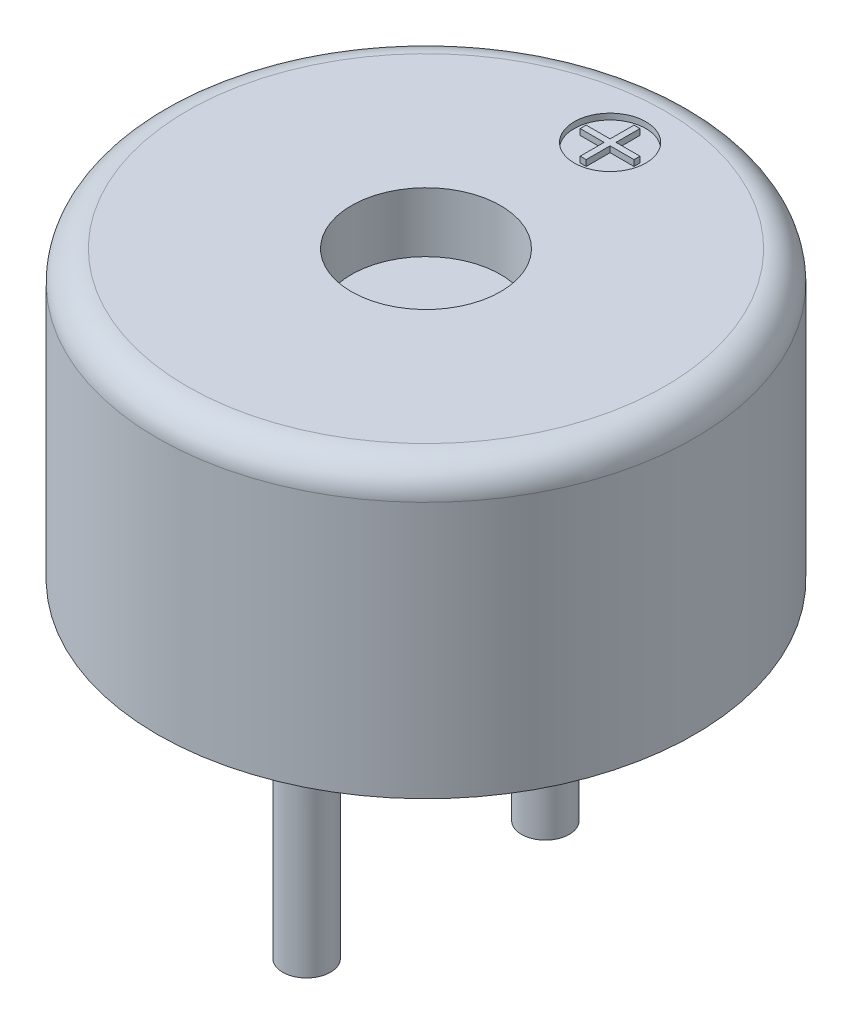
ISO-10303-21;
HEADER;
FILE_DESCRIPTION(('STEP AP214'),'2;1');
FILE_NAME('part.step','',(''),(''),'','','');
FILE_SCHEMA(('AUTOMOTIVE_DESIGN { 1 0 10303 214 1 1 1 1 }'));
ENDSEC;
DATA;
#1=APPLICATION_CONTEXT('core data for automotive mechanical design processes');
#2=APPLICATION_PROTOCOL_DEFINITION('international standard','automotive_design',2000,#1);
#3=PRODUCT_CONTEXT('',#1,'mechanical');
#4=PRODUCT('Part','Part','',(#3));
#5=PRODUCT_RELATED_PRODUCT_CATEGORY('part','',(#4));
#6=PRODUCT_DEFINITION_FORMATION('','',#4);
#7=PRODUCT_DEFINITION_CONTEXT('part definition',#1,'design');
#8=PRODUCT_DEFINITION('design','',#6,#7);
#9=PRODUCT_DEFINITION_SHAPE('','',#8);
#10=(LENGTH_UNIT() NAMED_UNIT(*) SI_UNIT(.MILLI.,.METRE.));
#11=(NAMED_UNIT(*) PLANE_ANGLE_UNIT() SI_UNIT($,.RADIAN.));
#12=(NAMED_UNIT(*) SI_UNIT($,.STERADIAN.) SOLID_ANGLE_UNIT());
#13=UNCERTAINTY_MEASURE_WITH_UNIT(LENGTH_MEASURE(1.E-05),#10,'distance_accuracy_value','');
#14=(GEOMETRIC_REPRESENTATION_CONTEXT(3) GLOBAL_UNCERTAINTY_ASSIGNED_CONTEXT((#13)) GLOBAL_UNIT_ASSIGNED_CONTEXT((#10,
#11,#12)) REPRESENTATION_CONTEXT('',''));
#15=CARTESIAN_POINT('',(0.,0.,0.));
#16=DIRECTION('',(0.,0.,1.));
#17=DIRECTION('',(1.,0.,0.));
#18=AXIS2_PLACEMENT_3D('',#15,#16,#17);
#19=CARTESIAN_POINT('',(0.,0.,0.));
#20=DIRECTION('',(0.,1.,0.));
#21=DIRECTION('',(0.,0.,1.));
#22=AXIS2_PLACEMENT_3D('',#19,#20,#21);
#23=PLANE('',#22);
#24=CARTESIAN_POINT('',(0.,0.,0.));
#25=DIRECTION('',(0.,1.,0.));
#26=DIRECTION('',(0.,0.,1.));
#27=AXIS2_PLACEMENT_3D('',#24,#25,#26);
#28=CIRCLE('',#27,4.5);
#29=CARTESIAN_POINT('',(0.,0.,4.5));
#30=VERTEX_POINT('',#29);
#31=EDGE_CURVE('E291',#30,#30,#28,.T.);
#32=ORIENTED_EDGE('',*,*,#31,.F.);
#33=EDGE_LOOP('',(#32));
#34=FACE_BOUND('',#33,.T.);
#35=CARTESIAN_POINT('',(0.,0.,-2.));
#36=DIRECTION('',(0.,1.,0.));
#37=DIRECTION('',(0.,0.,1.));
#38=AXIS2_PLACEMENT_3D('',#35,#36,#37);
#39=CIRCLE('',#38,0.4);
#40=CARTESIAN_POINT('',(0.,0.,-1.6));
#41=VERTEX_POINT('',#40);
#42=EDGE_CURVE('E48',#41,#41,#39,.F.);
#43=ORIENTED_EDGE('',*,*,#42,.F.);
#44=EDGE_LOOP('',(#43));
#45=FACE_BOUND('',#44,.T.);
#46=CARTESIAN_POINT('',(0.,0.,2.));
#47=DIRECTION('',(0.,1.,0.));
#48=DIRECTION('',(0.,0.,1.));
#49=AXIS2_PLACEMENT_3D('',#46,#47,#48);
#50=CIRCLE('',#49,0.4);
#51=CARTESIAN_POINT('',(0.,0.,2.4));
#52=VERTEX_POINT('',#51);
#53=EDGE_CURVE('E11',#52,#52,#50,.F.);
#54=ORIENTED_EDGE('',*,*,#53,.F.);
#55=EDGE_LOOP('',(#54));
#56=FACE_BOUND('',#55,.T.);
#57=ADVANCED_FACE('F39',(#34,#45,#56),#23,.F.);
#58=CARTESIAN_POINT('',(0.,4.8,0.));
#59=DIRECTION('',(0.,-1.,0.));
#60=DIRECTION('',(0.,0.,-1.));
#61=AXIS2_PLACEMENT_3D('',#58,#59,#60);
#62=CYLINDRICAL_SURFACE('',#61,4.5);
#63=CARTESIAN_POINT('',(0.,4.3,0.));
#64=DIRECTION('',(0.,1.,0.));
#65=DIRECTION('',(0.,0.,1.));
#66=AXIS2_PLACEMENT_3D('',#63,#64,#65);
#67=CIRCLE('',#66,4.5);
#68=CARTESIAN_POINT('',(0.,4.3,4.5));
#69=VERTEX_POINT('',#68);
#70=EDGE_CURVE('E299',#69,#69,#67,.F.);
#71=ORIENTED_EDGE('',*,*,#70,.T.);
#72=EDGE_LOOP('',(#71));
#73=FACE_BOUND('',#72,.T.);
#74=ORIENTED_EDGE('',*,*,#31,.T.);
#75=EDGE_LOOP('',(#74));
#76=FACE_BOUND('',#75,.T.);
#77=ADVANCED_FACE('F310',(#73,#76),#62,.T.);
#78=CARTESIAN_POINT('',(0.,4.8,0.));
#79=DIRECTION('',(0.,1.,0.));
#80=DIRECTION('',(0.,0.,1.));
#81=AXIS2_PLACEMENT_3D('',#78,#79,#80);
#82=PLANE('',#81);
#83=CARTESIAN_POINT('',(0.,4.8,-3.08377556902273));
#84=DIRECTION('',(0.,1.,0.));
#85=DIRECTION('',(0.,0.,1.));
#86=AXIS2_PLACEMENT_3D('',#83,#84,#85);
#87=CIRCLE('',#86,0.600000000000001);
#88=CARTESIAN_POINT('',(0.,4.8,-2.48377556902273));
#89=VERTEX_POINT('',#88);
#90=EDGE_CURVE('E238',#89,#89,#87,.T.);
#91=ORIENTED_EDGE('',*,*,#90,.F.);
#92=EDGE_LOOP('',(#91));
#93=FACE_BOUND('',#92,.T.);
#94=CARTESIAN_POINT('',(0.,4.8,0.));
#95=DIRECTION('',(0.,1.,0.));
#96=DIRECTION('',(0.,0.,1.));
#97=AXIS2_PLACEMENT_3D('',#94,#95,#96);
#98=CIRCLE('',#97,1.25);
#99=CARTESIAN_POINT('',(0.,4.8,1.25));
#100=VERTEX_POINT('',#99);
#101=EDGE_CURVE('E272',#100,#100,#98,.T.);
#102=ORIENTED_EDGE('',*,*,#101,.F.);
#103=EDGE_LOOP('',(#102));
#104=FACE_BOUND('',#103,.T.);
#105=CARTESIAN_POINT('',(0.,4.8,0.));
#106=DIRECTION('',(0.,1.,0.));
#107=DIRECTION('',(0.,0.,1.));
#108=AXIS2_PLACEMENT_3D('',#105,#106,#107);
#109=CIRCLE('',#108,4.);
#110=CARTESIAN_POINT('',(0.,4.8,4.));
#111=VERTEX_POINT('',#110);
#112=EDGE_CURVE('E295',#111,#111,#109,.T.);
#113=ORIENTED_EDGE('',*,*,#112,.T.);
#114=EDGE_LOOP('',(#113));
#115=FACE_BOUND('',#114,.T.);
#116=ADVANCED_FACE('F336',(#93,#104,#115),#82,.T.);
#117=CARTESIAN_POINT('',(0.,4.3,0.));
#118=DIRECTION('',(0.,1.,0.));
#119=DIRECTION('',(0.,0.,1.));
#120=AXIS2_PLACEMENT_3D('',#117,#118,#119);
#121=TOROIDAL_SURFACE('',#120,4.,0.5);
#122=ORIENTED_EDGE('',*,*,#70,.F.);
#123=EDGE_LOOP('',(#122));
#124=FACE_BOUND('',#123,.T.);
#125=ORIENTED_EDGE('',*,*,#112,.F.);
#126=EDGE_LOOP('',(#125));
#127=FACE_BOUND('',#126,.T.);
#128=ADVANCED_FACE('F41',(#124,#127),#121,.T.);
#129=CARTESIAN_POINT('',(0.,-4.5,-2.));
#130=DIRECTION('',(0.,1.,0.));
#131=DIRECTION('',(0.,0.,1.));
#132=AXIS2_PLACEMENT_3D('',#129,#130,#131);
#133=CYLINDRICAL_SURFACE('',#132,0.4);
#134=CARTESIAN_POINT('',(0.,-4.5,-2.));
#135=DIRECTION('',(0.,-1.,0.));
#136=DIRECTION('',(0.,0.,-1.));
#137=AXIS2_PLACEMENT_3D('',#134,#135,#136);
#138=CIRCLE('',#137,0.4);
#139=CARTESIAN_POINT('',(0.,-4.5,-2.4));
#140=VERTEX_POINT('',#139);
#141=EDGE_CURVE('E287',#140,#140,#138,.T.);
#142=ORIENTED_EDGE('',*,*,#141,.F.);
#143=EDGE_LOOP('',(#142));
#144=FACE_BOUND('',#143,.T.);
#145=ORIENTED_EDGE('',*,*,#42,.T.);
#146=EDGE_LOOP('',(#145));
#147=FACE_BOUND('',#146,.T.);
#148=ADVANCED_FACE('F306',(#144,#147),#133,.T.);
#149=CARTESIAN_POINT('',(0.,-4.5,-2.));
#150=DIRECTION('',(0.,-1.,0.));
#151=DIRECTION('',(0.,0.,-1.));
#152=AXIS2_PLACEMENT_3D('',#149,#150,#151);
#153=PLANE('',#152);
#154=ORIENTED_EDGE('',*,*,#141,.T.);
#155=EDGE_LOOP('',(#154));
#156=FACE_BOUND('',#155,.T.);
#157=ADVANCED_FACE('F318',(#156),#153,.T.);
#158=CARTESIAN_POINT('',(0.,-4.5,2.));
#159=DIRECTION('',(0.,1.,0.));
#160=DIRECTION('',(0.,0.,1.));
#161=AXIS2_PLACEMENT_3D('',#158,#159,#160);
#162=CYLINDRICAL_SURFACE('',#161,0.4);
#163=CARTESIAN_POINT('',(0.,-4.5,2.));
#164=DIRECTION('',(0.,-1.,0.));
#165=DIRECTION('',(0.,0.,-1.));
#166=AXIS2_PLACEMENT_3D('',#163,#164,#165);
#167=CIRCLE('',#166,0.4);
#168=CARTESIAN_POINT('',(0.,-4.5,1.6));
#169=VERTEX_POINT('',#168);
#170=EDGE_CURVE('E280',#169,#169,#167,.T.);
#171=ORIENTED_EDGE('',*,*,#170,.F.);
#172=EDGE_LOOP('',(#171));
#173=FACE_BOUND('',#172,.T.);
#174=ORIENTED_EDGE('',*,*,#53,.T.);
#175=EDGE_LOOP('',(#174));
#176=FACE_BOUND('',#175,.T.);
#177=ADVANCED_FACE('F315',(#173,#176),#162,.T.);
#178=CARTESIAN_POINT('',(0.,-4.5,2.));
#179=DIRECTION('',(0.,-1.,0.));
#180=DIRECTION('',(0.,0.,-1.));
#181=AXIS2_PLACEMENT_3D('',#178,#179,#180);
#182=PLANE('',#181);
#183=ORIENTED_EDGE('',*,*,#170,.T.);
#184=EDGE_LOOP('',(#183));
#185=FACE_BOUND('',#184,.T.);
#186=ADVANCED_FACE('F317',(#185),#182,.T.);
#187=CARTESIAN_POINT('',(0.,3.8,0.));
#188=DIRECTION('',(0.,1.,0.));
#189=DIRECTION('',(0.,0.,1.));
#190=AXIS2_PLACEMENT_3D('',#187,#188,#189);
#191=CYLINDRICAL_SURFACE('',#190,1.25);
#192=CARTESIAN_POINT('',(0.,3.8,0.));
#193=DIRECTION('',(0.,1.,0.));
#194=DIRECTION('',(0.,0.,1.));
#195=AXIS2_PLACEMENT_3D('',#192,#193,#194);
#196=CIRCLE('',#195,1.25);
#197=CARTESIAN_POINT('',(0.,3.8,1.25));
#198=VERTEX_POINT('',#197);
#199=EDGE_CURVE('E276',#198,#198,#196,.T.);
#200=ORIENTED_EDGE('',*,*,#199,.F.);
#201=EDGE_LOOP('',(#200));
#202=FACE_BOUND('',#201,.T.);
#203=ORIENTED_EDGE('',*,*,#101,.T.);
#204=EDGE_LOOP('',(#203));
#205=FACE_BOUND('',#204,.T.);
#206=ADVANCED_FACE('F325',(#202,#205),#191,.F.);
#207=CARTESIAN_POINT('',(0.,3.8,0.));
#208=DIRECTION('',(0.,1.,0.));
#209=DIRECTION('',(0.,0.,1.));
#210=AXIS2_PLACEMENT_3D('',#207,#208,#209);
#211=PLANE('',#210);
#212=ORIENTED_EDGE('',*,*,#199,.T.);
#213=EDGE_LOOP('',(#212));
#214=FACE_BOUND('',#213,.T.);
#215=ADVANCED_FACE('F384',(#214),#211,.T.);
#216=CARTESIAN_POINT('',(0.,4.7,-3.08377556902273));
#217=DIRECTION('',(0.,1.,0.));
#218=DIRECTION('',(0.,0.,1.));
#219=AXIS2_PLACEMENT_3D('',#216,#217,#218);
#220=CYLINDRICAL_SURFACE('',#219,0.600000000000001);
#221=CARTESIAN_POINT('',(0.,4.7,-3.08377556902273));
#222=DIRECTION('',(0.,1.,0.));
#223=DIRECTION('',(0.,0.,1.));
#224=AXIS2_PLACEMENT_3D('',#221,#222,#223);
#225=CIRCLE('',#224,0.600000000000001);
#226=CARTESIAN_POINT('',(0.,4.7,-2.48377556902273));
#227=VERTEX_POINT('',#226);
#228=EDGE_CURVE('E268',#227,#227,#225,.T.);
#229=ORIENTED_EDGE('',*,*,#228,.F.);
#230=EDGE_LOOP('',(#229));
#231=FACE_BOUND('',#230,.T.);
#232=ORIENTED_EDGE('',*,*,#90,.T.);
#233=EDGE_LOOP('',(#232));
#234=FACE_BOUND('',#233,.T.);
#235=ADVANCED_FACE('F392',(#231,#234),#220,.F.);
#236=CARTESIAN_POINT('',(0.,4.7,-3.08377556902273));
#237=DIRECTION('',(0.,1.,0.));
#238=DIRECTION('',(0.,0.,1.));
#239=AXIS2_PLACEMENT_3D('',#236,#237,#238);
#240=PLANE('',#239);
#241=DIRECTION('',(0.,0.,-1.));
#242=VECTOR('',#241,1.);
#243=CARTESIAN_POINT('',(0.0500000000000001,4.7,-2.63377556902273));
#244=LINE('',#243,#242);
#245=CARTESIAN_POINT('',(0.0500000000000001,4.7,-2.63377556902273));
#246=VERTEX_POINT('',#245);
#247=CARTESIAN_POINT('',(0.0500000000000001,4.7,-3.03377556902273));
#248=VERTEX_POINT('',#247);
#249=EDGE_CURVE('E142',#246,#248,#244,.T.);
#250=ORIENTED_EDGE('',*,*,#249,.F.);
#251=DIRECTION('',(1.,0.,0.));
#252=VECTOR('',#251,1.);
#253=CARTESIAN_POINT('',(0.0500000000000001,4.7,-2.63377556902273));
#254=LINE('',#253,#252);
#255=CARTESIAN_POINT('',(-0.0499999999999998,4.7,-2.63377556902273));
#256=VERTEX_POINT('',#255);
#257=EDGE_CURVE('E192',#256,#246,#254,.T.);
#258=ORIENTED_EDGE('',*,*,#257,.F.);
#259=DIRECTION('',(0.,0.,1.));
#260=VECTOR('',#259,1.);
#261=CARTESIAN_POINT('',(-0.0499999999999998,4.7,-2.63377556902273));
#262=LINE('',#261,#260);
#263=CARTESIAN_POINT('',(-0.0499999999999999,4.7,-3.03377556902273));
#264=VERTEX_POINT('',#263);
#265=EDGE_CURVE('E188',#264,#256,#262,.T.);
#266=ORIENTED_EDGE('',*,*,#265,.F.);
#267=DIRECTION('',(1.,0.,0.));
#268=VECTOR('',#267,1.);
#269=CARTESIAN_POINT('',(-0.0499999999999999,4.7,-3.03377556902273));
#270=LINE('',#269,#268);
#271=CARTESIAN_POINT('',(-0.45,4.7,-3.03377556902273));
#272=VERTEX_POINT('',#271);
#273=EDGE_CURVE('E184',#272,#264,#270,.T.);
#274=ORIENTED_EDGE('',*,*,#273,.F.);
#275=DIRECTION('',(0.,0.,1.));
#276=VECTOR('',#275,1.);
#277=CARTESIAN_POINT('',(-0.45,4.7,-3.13377556902273));
#278=LINE('',#277,#276);
#279=CARTESIAN_POINT('',(-0.45,4.7,-3.13377556902273));
#280=VERTEX_POINT('',#279);
#281=EDGE_CURVE('E180',#280,#272,#278,.T.);
#282=ORIENTED_EDGE('',*,*,#281,.F.);
#283=DIRECTION('',(-1.,0.,0.));
#284=VECTOR('',#283,1.);
#285=CARTESIAN_POINT('',(-0.0499999999999999,4.7,-3.13377556902273));
#286=LINE('',#285,#284);
#287=CARTESIAN_POINT('',(-0.0499999999999999,4.7,-3.13377556902273));
#288=VERTEX_POINT('',#287);
#289=EDGE_CURVE('E176',#288,#280,#286,.T.);
#290=ORIENTED_EDGE('',*,*,#289,.F.);
#291=DIRECTION('',(0.,0.,1.));
#292=VECTOR('',#291,1.);
#293=CARTESIAN_POINT('',(-0.05,4.7,-3.53377556902273));
#294=LINE('',#293,#292);
#295=CARTESIAN_POINT('',(-0.05,4.7,-3.53377556902273));
#296=VERTEX_POINT('',#295);
#297=EDGE_CURVE('E172',#296,#288,#294,.T.);
#298=ORIENTED_EDGE('',*,*,#297,.F.);
#299=DIRECTION('',(-1.,0.,0.));
#300=VECTOR('',#299,1.);
#301=CARTESIAN_POINT('',(0.05,4.7,-3.53377556902273));
#302=LINE('',#301,#300);
#303=CARTESIAN_POINT('',(0.05,4.7,-3.53377556902273));
#304=VERTEX_POINT('',#303);
#305=EDGE_CURVE('E168',#304,#296,#302,.T.);
#306=ORIENTED_EDGE('',*,*,#305,.F.);
#307=DIRECTION('',(0.,0.,-1.));
#308=VECTOR('',#307,1.);
#309=CARTESIAN_POINT('',(0.05,4.7,-3.53377556902273));
#310=LINE('',#309,#308);
#311=CARTESIAN_POINT('',(0.0499999999999999,4.7,-3.13377556902273));
#312=VERTEX_POINT('',#311);
#313=EDGE_CURVE('E164',#312,#304,#310,.T.);
#314=ORIENTED_EDGE('',*,*,#313,.F.);
#315=DIRECTION('',(-1.,0.,0.));
#316=VECTOR('',#315,1.);
#317=CARTESIAN_POINT('',(0.0499999999999999,4.7,-3.13377556902273));
#318=LINE('',#317,#316);
#319=CARTESIAN_POINT('',(0.45,4.7,-3.13377556902273));
#320=VERTEX_POINT('',#319);
#321=EDGE_CURVE('E63',#320,#312,#318,.T.);
#322=ORIENTED_EDGE('',*,*,#321,.F.);
#323=DIRECTION('',(0.,0.,-1.));
#324=VECTOR('',#323,1.);
#325=CARTESIAN_POINT('',(0.45,4.7,-3.13377556902273));
#326=LINE('',#325,#324);
#327=CARTESIAN_POINT('',(0.45,4.7,-3.03377556902273));
#328=VERTEX_POINT('',#327);
#329=EDGE_CURVE('E133',#328,#320,#326,.T.);
#330=ORIENTED_EDGE('',*,*,#329,.F.);
#331=DIRECTION('',(1.,0.,0.));
#332=VECTOR('',#331,1.);
#333=CARTESIAN_POINT('',(0.0500000000000001,4.7,-3.03377556902273));
#334=LINE('',#333,#332);
#335=EDGE_CURVE('E148',#248,#328,#334,.T.);
#336=ORIENTED_EDGE('',*,*,#335,.F.);
#337=EDGE_LOOP('',(#250,#258,#266,#274,#282,#290,#298,#306,#314,#322,#330,#336));
#338=FACE_BOUND('',#337,.T.);
#339=ORIENTED_EDGE('',*,*,#228,.T.);
#340=EDGE_LOOP('',(#339));
#341=FACE_BOUND('',#340,.T.);
#342=ADVANCED_FACE('F146',(#338,#341),#240,.T.);
#343=CARTESIAN_POINT('',(0.0500000000000001,4.7,-3.03377556902273));
#344=DIRECTION('',(0.,0.,1.));
#345=DIRECTION('',(1.,0.,0.));
#346=AXIS2_PLACEMENT_3D('',#343,#344,#345);
#347=PLANE('',#346);
#348=DIRECTION('',(1.,0.,0.));
#349=VECTOR('',#348,1.);
#350=CARTESIAN_POINT('',(0.0500000000000001,4.8,-3.03377556902273));
#351=LINE('',#350,#349);
#352=CARTESIAN_POINT('',(0.0500000000000001,4.8,-3.03377556902273));
#353=VERTEX_POINT('',#352);
#354=CARTESIAN_POINT('',(0.45,4.8,-3.03377556902273));
#355=VERTEX_POINT('',#354);
#356=EDGE_CURVE('E198',#353,#355,#351,.T.);
#357=ORIENTED_EDGE('',*,*,#356,.F.);
#358=DIRECTION('',(0.,1.,0.));
#359=VECTOR('',#358,1.);
#360=CARTESIAN_POINT('',(0.0500000000000001,4.7,-3.03377556902273));
#361=LINE('',#360,#359);
#362=EDGE_CURVE('E153',#248,#353,#361,.T.);
#363=ORIENTED_EDGE('',*,*,#362,.F.);
#364=ORIENTED_EDGE('',*,*,#335,.T.);
#365=DIRECTION('',(0.,1.,0.));
#366=VECTOR('',#365,1.);
#367=CARTESIAN_POINT('',(0.45,4.7,-3.03377556902273));
#368=LINE('',#367,#366);
#369=EDGE_CURVE('E131',#328,#355,#368,.T.);
#370=ORIENTED_EDGE('',*,*,#369,.T.);
#371=EDGE_LOOP('',(#357,#363,#364,#370));
#372=FACE_BOUND('',#371,.T.);
#373=ADVANCED_FACE('F152',(#372),#347,.T.);
#374=CARTESIAN_POINT('',(0.0500000000000001,4.7,-2.63377556902273));
#375=DIRECTION('',(1.,0.,0.));
#376=DIRECTION('',(0.,0.,-1.));
#377=AXIS2_PLACEMENT_3D('',#374,#375,#376);
#378=PLANE('',#377);
#379=DIRECTION('',(0.,0.,-1.));
#380=VECTOR('',#379,1.);
#381=CARTESIAN_POINT('',(0.0500000000000001,4.8,-2.63377556902273));
#382=LINE('',#381,#380);
#383=CARTESIAN_POINT('',(0.0500000000000001,4.8,-2.63377556902273));
#384=VERTEX_POINT('',#383);
#385=EDGE_CURVE('E155',#384,#353,#382,.T.);
#386=ORIENTED_EDGE('',*,*,#385,.F.);
#387=DIRECTION('',(0.,1.,0.));
#388=VECTOR('',#387,1.);
#389=CARTESIAN_POINT('',(0.0500000000000001,4.7,-2.63377556902273));
#390=LINE('',#389,#388);
#391=EDGE_CURVE('E239',#246,#384,#390,.T.);
#392=ORIENTED_EDGE('',*,*,#391,.F.);
#393=ORIENTED_EDGE('',*,*,#249,.T.);
#394=ORIENTED_EDGE('',*,*,#362,.T.);
#395=EDGE_LOOP('',(#386,#392,#393,#394));
#396=FACE_BOUND('',#395,.T.);
#397=ADVANCED_FACE('F426',(#396),#378,.T.);
#398=CARTESIAN_POINT('',(0.0500000000000001,4.7,-2.63377556902273));
#399=DIRECTION('',(0.,0.,1.));
#400=DIRECTION('',(1.,0.,0.));
#401=AXIS2_PLACEMENT_3D('',#398,#399,#400);
#402=PLANE('',#401);
#403=DIRECTION('',(1.,0.,0.));
#404=VECTOR('',#403,1.);
#405=CARTESIAN_POINT('',(0.0500000000000001,4.8,-2.63377556902273));
#406=LINE('',#405,#404);
#407=CARTESIAN_POINT('',(-0.0499999999999998,4.8,-2.63377556902273));
#408=VERTEX_POINT('',#407);
#409=EDGE_CURVE('E159',#408,#384,#406,.T.);
#410=ORIENTED_EDGE('',*,*,#409,.F.);
#411=DIRECTION('',(0.,1.,0.));
#412=VECTOR('',#411,1.);
#413=CARTESIAN_POINT('',(-0.0499999999999998,4.7,-2.63377556902273));
#414=LINE('',#413,#412);
#415=EDGE_CURVE('E242',#256,#408,#414,.T.);
#416=ORIENTED_EDGE('',*,*,#415,.F.);
#417=ORIENTED_EDGE('',*,*,#257,.T.);
#418=ORIENTED_EDGE('',*,*,#391,.T.);
#419=EDGE_LOOP('',(#410,#416,#417,#418));
#420=FACE_BOUND('',#419,.T.);
#421=ADVANCED_FACE('F435',(#420),#402,.T.);
#422=CARTESIAN_POINT('',(-0.0499999999999998,4.7,-2.63377556902273));
#423=DIRECTION('',(-1.,0.,0.));
#424=DIRECTION('',(0.,0.,1.));
#425=AXIS2_PLACEMENT_3D('',#422,#423,#424);
#426=PLANE('',#425);
#427=DIRECTION('',(0.,0.,1.));
#428=VECTOR('',#427,1.);
#429=CARTESIAN_POINT('',(-0.0499999999999998,4.8,-2.63377556902273));
#430=LINE('',#429,#428);
#431=CARTESIAN_POINT('',(-0.0499999999999999,4.8,-3.03377556902273));
#432=VERTEX_POINT('',#431);
#433=EDGE_CURVE('E229',#432,#408,#430,.T.);
#434=ORIENTED_EDGE('',*,*,#433,.F.);
#435=DIRECTION('',(0.,1.,0.));
#436=VECTOR('',#435,1.);
#437=CARTESIAN_POINT('',(-0.0499999999999999,4.7,-3.03377556902273));
#438=LINE('',#437,#436);
#439=EDGE_CURVE('E245',#264,#432,#438,.T.);
#440=ORIENTED_EDGE('',*,*,#439,.F.);
#441=ORIENTED_EDGE('',*,*,#265,.T.);
#442=ORIENTED_EDGE('',*,*,#415,.T.);
#443=EDGE_LOOP('',(#434,#440,#441,#442));
#444=FACE_BOUND('',#443,.T.);
#445=ADVANCED_FACE('F445',(#444),#426,.T.);
#446=CARTESIAN_POINT('',(-0.0499999999999999,4.7,-3.03377556902273));
#447=DIRECTION('',(0.,0.,1.));
#448=DIRECTION('',(1.,0.,0.));
#449=AXIS2_PLACEMENT_3D('',#446,#447,#448);
#450=PLANE('',#449);
#451=DIRECTION('',(1.,0.,0.));
#452=VECTOR('',#451,1.);
#453=CARTESIAN_POINT('',(-0.0499999999999999,4.8,-3.03377556902273));
#454=LINE('',#453,#452);
#455=CARTESIAN_POINT('',(-0.45,4.8,-3.03377556902273));
#456=VERTEX_POINT('',#455);
#457=EDGE_CURVE('E225',#456,#432,#454,.T.);
#458=ORIENTED_EDGE('',*,*,#457,.F.);
#459=DIRECTION('',(0.,1.,0.));
#460=VECTOR('',#459,1.);
#461=CARTESIAN_POINT('',(-0.45,4.7,-3.03377556902273));
#462=LINE('',#461,#460);
#463=EDGE_CURVE('E248',#272,#456,#462,.T.);
#464=ORIENTED_EDGE('',*,*,#463,.F.);
#465=ORIENTED_EDGE('',*,*,#273,.T.);
#466=ORIENTED_EDGE('',*,*,#439,.T.);
#467=EDGE_LOOP('',(#458,#464,#465,#466));
#468=FACE_BOUND('',#467,.T.);
#469=ADVANCED_FACE('F455',(#468),#450,.T.);
#470=CARTESIAN_POINT('',(-0.45,4.7,-3.13377556902273));
#471=DIRECTION('',(-1.,0.,0.));
#472=DIRECTION('',(0.,0.,1.));
#473=AXIS2_PLACEMENT_3D('',#470,#471,#472);
#474=PLANE('',#473);
#475=DIRECTION('',(0.,0.,1.));
#476=VECTOR('',#475,1.);
#477=CARTESIAN_POINT('',(-0.45,4.8,-3.13377556902273));
#478=LINE('',#477,#476);
#479=CARTESIAN_POINT('',(-0.45,4.8,-3.13377556902273));
#480=VERTEX_POINT('',#479);
#481=EDGE_CURVE('E221',#480,#456,#478,.T.);
#482=ORIENTED_EDGE('',*,*,#481,.F.);
#483=DIRECTION('',(0.,1.,0.));
#484=VECTOR('',#483,1.);
#485=CARTESIAN_POINT('',(-0.45,4.7,-3.13377556902273));
#486=LINE('',#485,#484);
#487=EDGE_CURVE('E251',#280,#480,#486,.T.);
#488=ORIENTED_EDGE('',*,*,#487,.F.);
#489=ORIENTED_EDGE('',*,*,#281,.T.);
#490=ORIENTED_EDGE('',*,*,#463,.T.);
#491=EDGE_LOOP('',(#482,#488,#489,#490));
#492=FACE_BOUND('',#491,.T.);
#493=ADVANCED_FACE('F465',(#492),#474,.T.);
#494=CARTESIAN_POINT('',(-0.0499999999999999,4.7,-3.13377556902273));
#495=DIRECTION('',(0.,0.,-1.));
#496=DIRECTION('',(-1.,0.,0.));
#497=AXIS2_PLACEMENT_3D('',#494,#495,#496);
#498=PLANE('',#497);
#499=DIRECTION('',(-1.,0.,0.));
#500=VECTOR('',#499,1.);
#501=CARTESIAN_POINT('',(-0.0499999999999999,4.8,-3.13377556902273));
#502=LINE('',#501,#500);
#503=CARTESIAN_POINT('',(-0.0499999999999999,4.8,-3.13377556902273));
#504=VERTEX_POINT('',#503);
#505=EDGE_CURVE('E217',#504,#480,#502,.T.);
#506=ORIENTED_EDGE('',*,*,#505,.F.);
#507=DIRECTION('',(0.,1.,0.));
#508=VECTOR('',#507,1.);
#509=CARTESIAN_POINT('',(-0.0499999999999999,4.7,-3.13377556902273));
#510=LINE('',#509,#508);
#511=EDGE_CURVE('E254',#288,#504,#510,.T.);
#512=ORIENTED_EDGE('',*,*,#511,.F.);
#513=ORIENTED_EDGE('',*,*,#289,.T.);
#514=ORIENTED_EDGE('',*,*,#487,.T.);
#515=EDGE_LOOP('',(#506,#512,#513,#514));
#516=FACE_BOUND('',#515,.T.);
#517=ADVANCED_FACE('F475',(#516),#498,.T.);
#518=CARTESIAN_POINT('',(-0.05,4.7,-3.53377556902273));
#519=DIRECTION('',(-1.,0.,0.));
#520=DIRECTION('',(0.,0.,1.));
#521=AXIS2_PLACEMENT_3D('',#518,#519,#520);
#522=PLANE('',#521);
#523=DIRECTION('',(0.,0.,1.));
#524=VECTOR('',#523,1.);
#525=CARTESIAN_POINT('',(-0.05,4.8,-3.53377556902273));
#526=LINE('',#525,#524);
#527=CARTESIAN_POINT('',(-0.05,4.8,-3.53377556902273));
#528=VERTEX_POINT('',#527);
#529=EDGE_CURVE('E213',#528,#504,#526,.T.);
#530=ORIENTED_EDGE('',*,*,#529,.F.);
#531=DIRECTION('',(0.,1.,0.));
#532=VECTOR('',#531,1.);
#533=CARTESIAN_POINT('',(-0.05,4.7,-3.53377556902273));
#534=LINE('',#533,#532);
#535=EDGE_CURVE('E257',#296,#528,#534,.T.);
#536=ORIENTED_EDGE('',*,*,#535,.F.);
#537=ORIENTED_EDGE('',*,*,#297,.T.);
#538=ORIENTED_EDGE('',*,*,#511,.T.);
#539=EDGE_LOOP('',(#530,#536,#537,#538));
#540=FACE_BOUND('',#539,.T.);
#541=ADVANCED_FACE('F485',(#540),#522,.T.);
#542=CARTESIAN_POINT('',(0.05,4.7,-3.53377556902273));
#543=DIRECTION('',(0.,0.,-1.));
#544=DIRECTION('',(-1.,0.,0.));
#545=AXIS2_PLACEMENT_3D('',#542,#543,#544);
#546=PLANE('',#545);
#547=DIRECTION('',(-1.,0.,0.));
#548=VECTOR('',#547,1.);
#549=CARTESIAN_POINT('',(0.05,4.8,-3.53377556902273));
#550=LINE('',#549,#548);
#551=CARTESIAN_POINT('',(0.05,4.8,-3.53377556902273));
#552=VERTEX_POINT('',#551);
#553=EDGE_CURVE('E209',#552,#528,#550,.T.);
#554=ORIENTED_EDGE('',*,*,#553,.F.);
#555=DIRECTION('',(0.,1.,0.));
#556=VECTOR('',#555,1.);
#557=CARTESIAN_POINT('',(0.05,4.7,-3.53377556902273));
#558=LINE('',#557,#556);
#559=EDGE_CURVE('E260',#304,#552,#558,.T.);
#560=ORIENTED_EDGE('',*,*,#559,.F.);
#561=ORIENTED_EDGE('',*,*,#305,.T.);
#562=ORIENTED_EDGE('',*,*,#535,.T.);
#563=EDGE_LOOP('',(#554,#560,#561,#562));
#564=FACE_BOUND('',#563,.T.);
#565=ADVANCED_FACE('F495',(#564),#546,.T.);
#566=CARTESIAN_POINT('',(0.05,4.7,-3.53377556902273));
#567=DIRECTION('',(1.,0.,0.));
#568=DIRECTION('',(0.,0.,-1.));
#569=AXIS2_PLACEMENT_3D('',#566,#567,#568);
#570=PLANE('',#569);
#571=DIRECTION('',(0.,0.,-1.));
#572=VECTOR('',#571,1.);
#573=CARTESIAN_POINT('',(0.05,4.8,-3.53377556902273));
#574=LINE('',#573,#572);
#575=CARTESIAN_POINT('',(0.0499999999999999,4.8,-3.13377556902273));
#576=VERTEX_POINT('',#575);
#577=EDGE_CURVE('E205',#576,#552,#574,.T.);
#578=ORIENTED_EDGE('',*,*,#577,.F.);
#579=DIRECTION('',(0.,1.,0.));
#580=VECTOR('',#579,1.);
#581=CARTESIAN_POINT('',(0.0499999999999999,4.7,-3.13377556902273));
#582=LINE('',#581,#580);
#583=EDGE_CURVE('E263',#312,#576,#582,.T.);
#584=ORIENTED_EDGE('',*,*,#583,.F.);
#585=ORIENTED_EDGE('',*,*,#313,.T.);
#586=ORIENTED_EDGE('',*,*,#559,.T.);
#587=EDGE_LOOP('',(#578,#584,#585,#586));
#588=FACE_BOUND('',#587,.T.);
#589=ADVANCED_FACE('F505',(#588),#570,.T.);
#590=CARTESIAN_POINT('',(0.0499999999999999,4.7,-3.13377556902273));
#591=DIRECTION('',(0.,0.,-1.));
#592=DIRECTION('',(-1.,0.,0.));
#593=AXIS2_PLACEMENT_3D('',#590,#591,#592);
#594=PLANE('',#593);
#595=DIRECTION('',(-1.,0.,0.));
#596=VECTOR('',#595,1.);
#597=CARTESIAN_POINT('',(0.0499999999999999,4.8,-3.13377556902273));
#598=LINE('',#597,#596);
#599=CARTESIAN_POINT('',(0.45,4.8,-3.13377556902273));
#600=VERTEX_POINT('',#599);
#601=EDGE_CURVE('E55',#600,#576,#598,.T.);
#602=ORIENTED_EDGE('',*,*,#601,.F.);
#603=DIRECTION('',(0.,1.,0.));
#604=VECTOR('',#603,1.);
#605=CARTESIAN_POINT('',(0.45,4.7,-3.13377556902273));
#606=LINE('',#605,#604);
#607=EDGE_CURVE('E141',#320,#600,#606,.T.);
#608=ORIENTED_EDGE('',*,*,#607,.F.);
#609=ORIENTED_EDGE('',*,*,#321,.T.);
#610=ORIENTED_EDGE('',*,*,#583,.T.);
#611=EDGE_LOOP('',(#602,#608,#609,#610));
#612=FACE_BOUND('',#611,.T.);
#613=ADVANCED_FACE('F515',(#612),#594,.T.);
#614=CARTESIAN_POINT('',(0.45,4.7,-3.13377556902273));
#615=DIRECTION('',(1.,0.,0.));
#616=DIRECTION('',(0.,0.,-1.));
#617=AXIS2_PLACEMENT_3D('',#614,#615,#616);
#618=PLANE('',#617);
#619=DIRECTION('',(0.,0.,-1.));
#620=VECTOR('',#619,1.);
#621=CARTESIAN_POINT('',(0.45,4.8,-3.13377556902273));
#622=LINE('',#621,#620);
#623=EDGE_CURVE('E135',#355,#600,#622,.T.);
#624=ORIENTED_EDGE('',*,*,#623,.F.);
#625=ORIENTED_EDGE('',*,*,#369,.F.);
#626=ORIENTED_EDGE('',*,*,#329,.T.);
#627=ORIENTED_EDGE('',*,*,#607,.T.);
#628=EDGE_LOOP('',(#624,#625,#626,#627));
#629=FACE_BOUND('',#628,.T.);
#630=ADVANCED_FACE('F132',(#629),#618,.T.);
#631=ORIENTED_EDGE('',*,*,#385,.T.);
#632=ORIENTED_EDGE('',*,*,#356,.T.);
#633=ORIENTED_EDGE('',*,*,#623,.T.);
#634=ORIENTED_EDGE('',*,*,#601,.T.);
#635=ORIENTED_EDGE('',*,*,#577,.T.);
#636=ORIENTED_EDGE('',*,*,#553,.T.);
#637=ORIENTED_EDGE('',*,*,#529,.T.);
#638=ORIENTED_EDGE('',*,*,#505,.T.);
#639=ORIENTED_EDGE('',*,*,#481,.T.);
#640=ORIENTED_EDGE('',*,*,#457,.T.);
#641=ORIENTED_EDGE('',*,*,#433,.T.);
#642=ORIENTED_EDGE('',*,*,#409,.T.);
#643=EDGE_LOOP('',(#631,#632,#633,#634,#635,#636,#637,#638,#639,#640,#641,#642));
#644=FACE_BOUND('',#643,.T.);
#645=ADVANCED_FACE('F339',(#644),#82,.T.);
#646=CLOSED_SHELL('',(#57,#77,#116,#128,#148,#157,#177,#186,#206,#215,#235,#342,#373,#397,#421,
#445,#469,#493,#517,#541,#565,#589,#613,#630,#645));
#647=MANIFOLD_SOLID_BREP('B2',#646);
#648=ADVANCED_BREP_SHAPE_REPRESENTATION('',(#18,#647),#14);
#649=SHAPE_DEFINITION_REPRESENTATION(#9,#648);
ENDSEC;
END-ISO-10303-21;
